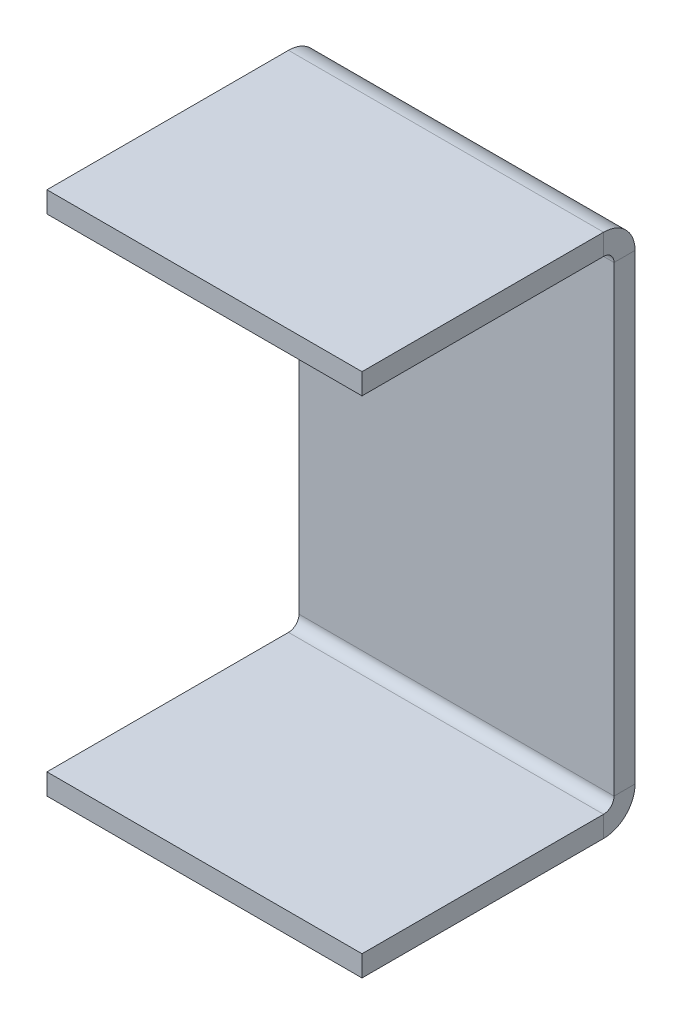
ISO-10303-21;
HEADER;
FILE_DESCRIPTION(('STEP AP214'),'2;1');
FILE_NAME('part.step','',(''),(''),'','','');
FILE_SCHEMA(('AUTOMOTIVE_DESIGN { 1 0 10303 214 1 1 1 1 }'));
ENDSEC;
DATA;
#1=APPLICATION_CONTEXT('core data for automotive mechanical design processes');
#2=APPLICATION_PROTOCOL_DEFINITION('international standard','automotive_design',2000,#1);
#3=PRODUCT_CONTEXT('',#1,'mechanical');
#4=PRODUCT('Part','Part','',(#3));
#5=PRODUCT_RELATED_PRODUCT_CATEGORY('part','',(#4));
#6=PRODUCT_DEFINITION_FORMATION('','',#4);
#7=PRODUCT_DEFINITION_CONTEXT('part definition',#1,'design');
#8=PRODUCT_DEFINITION('design','',#6,#7);
#9=PRODUCT_DEFINITION_SHAPE('','',#8);
#10=(LENGTH_UNIT() NAMED_UNIT(*) SI_UNIT(.MILLI.,.METRE.));
#11=(NAMED_UNIT(*) PLANE_ANGLE_UNIT() SI_UNIT($,.RADIAN.));
#12=(NAMED_UNIT(*) SI_UNIT($,.STERADIAN.) SOLID_ANGLE_UNIT());
#13=UNCERTAINTY_MEASURE_WITH_UNIT(LENGTH_MEASURE(1.E-05),#10,'distance_accuracy_value','');
#14=(GEOMETRIC_REPRESENTATION_CONTEXT(3) GLOBAL_UNCERTAINTY_ASSIGNED_CONTEXT((#13)) GLOBAL_UNIT_ASSIGNED_CONTEXT((#10,
#11,#12)) REPRESENTATION_CONTEXT('',''));
#15=CARTESIAN_POINT('',(0.,0.,0.));
#16=DIRECTION('',(0.,0.,1.));
#17=DIRECTION('',(1.,0.,0.));
#18=AXIS2_PLACEMENT_3D('',#15,#16,#17);
#19=CARTESIAN_POINT('',(0.,0.,-10.));
#20=DIRECTION('',(0.,0.,1.));
#21=DIRECTION('',(1.,0.,0.));
#22=AXIS2_PLACEMENT_3D('',#19,#20,#21);
#23=PLANE('',#22);
#24=DIRECTION('',(1.,0.,0.));
#25=VECTOR('',#24,1.);
#26=CARTESIAN_POINT('',(75.,-110.,-10.));
#27=LINE('',#26,#25);
#28=CARTESIAN_POINT('',(75.,-110.,-10.));
#29=VERTEX_POINT('',#28);
#30=CARTESIAN_POINT('',(-75.,-110.,-10.));
#31=VERTEX_POINT('',#30);
#32=EDGE_CURVE('E215',#29,#31,#27,.F.);
#33=ORIENTED_EDGE('',*,*,#32,.T.);
#34=DIRECTION('',(0.,-1.,0.));
#35=VECTOR('',#34,1.);
#36=CARTESIAN_POINT('',(-75.,125.,-10.));
#37=LINE('',#36,#35);
#38=CARTESIAN_POINT('',(-75.,110.,-10.));
#39=VERTEX_POINT('',#38);
#40=EDGE_CURVE('E13',#39,#31,#37,.T.);
#41=ORIENTED_EDGE('',*,*,#40,.F.);
#42=DIRECTION('',(-1.,0.,0.));
#43=VECTOR('',#42,1.);
#44=CARTESIAN_POINT('',(-75.,110.,-10.));
#45=LINE('',#44,#43);
#46=CARTESIAN_POINT('',(75.,110.,-10.));
#47=VERTEX_POINT('',#46);
#48=EDGE_CURVE('E269',#39,#47,#45,.F.);
#49=ORIENTED_EDGE('',*,*,#48,.T.);
#50=DIRECTION('',(0.,1.,0.));
#51=VECTOR('',#50,1.);
#52=CARTESIAN_POINT('',(75.,125.,-10.));
#53=LINE('',#52,#51);
#54=EDGE_CURVE('E88',#29,#47,#53,.T.);
#55=ORIENTED_EDGE('',*,*,#54,.F.);
#56=EDGE_LOOP('',(#33,#41,#49,#55));
#57=FACE_BOUND('',#56,.T.);
#58=ADVANCED_FACE('F79',(#57),#23,.F.);
#59=CARTESIAN_POINT('',(0.,0.,0.));
#60=DIRECTION('',(0.,0.,1.));
#61=DIRECTION('',(1.,0.,0.));
#62=AXIS2_PLACEMENT_3D('',#59,#60,#61);
#63=PLANE('',#62);
#64=DIRECTION('',(0.,-1.,0.));
#65=VECTOR('',#64,1.);
#66=CARTESIAN_POINT('',(-75.,125.,0.));
#67=LINE('',#66,#65);
#68=CARTESIAN_POINT('',(-75.,110.,0.));
#69=VERTEX_POINT('',#68);
#70=CARTESIAN_POINT('',(-75.,-110.,0.));
#71=VERTEX_POINT('',#70);
#72=EDGE_CURVE('E83',#69,#71,#67,.T.);
#73=ORIENTED_EDGE('',*,*,#72,.T.);
#74=DIRECTION('',(1.,0.,0.));
#75=VECTOR('',#74,1.);
#76=CARTESIAN_POINT('',(75.,-110.,0.));
#77=LINE('',#76,#75);
#78=CARTESIAN_POINT('',(75.,-110.,0.));
#79=VERTEX_POINT('',#78);
#80=EDGE_CURVE('E227',#79,#71,#77,.F.);
#81=ORIENTED_EDGE('',*,*,#80,.F.);
#82=DIRECTION('',(0.,1.,0.));
#83=VECTOR('',#82,1.);
#84=CARTESIAN_POINT('',(75.,125.,0.));
#85=LINE('',#84,#83);
#86=CARTESIAN_POINT('',(75.,110.,0.));
#87=VERTEX_POINT('',#86);
#88=EDGE_CURVE('E287',#79,#87,#85,.T.);
#89=ORIENTED_EDGE('',*,*,#88,.T.);
#90=DIRECTION('',(-1.,0.,0.));
#91=VECTOR('',#90,1.);
#92=CARTESIAN_POINT('',(-75.,110.,0.));
#93=LINE('',#92,#91);
#94=EDGE_CURVE('E96',#69,#87,#93,.F.);
#95=ORIENTED_EDGE('',*,*,#94,.F.);
#96=EDGE_LOOP('',(#73,#81,#89,#95));
#97=FACE_BOUND('',#96,.T.);
#98=ADVANCED_FACE('F291',(#97),#63,.T.);
#99=CARTESIAN_POINT('',(75.,125.,-10.));
#100=DIRECTION('',(1.,0.,0.));
#101=DIRECTION('',(0.,0.,-1.));
#102=AXIS2_PLACEMENT_3D('',#99,#100,#101);
#103=PLANE('',#102);
#104=ORIENTED_EDGE('',*,*,#88,.F.);
#105=DIRECTION('',(0.,0.,-1.));
#106=VECTOR('',#105,1.);
#107=CARTESIAN_POINT('',(75.,-110.,0.));
#108=LINE('',#107,#106);
#109=EDGE_CURVE('E221',#79,#29,#108,.T.);
#110=ORIENTED_EDGE('',*,*,#109,.T.);
#111=ORIENTED_EDGE('',*,*,#54,.T.);
#112=DIRECTION('',(0.,0.,-1.));
#113=VECTOR('',#112,1.);
#114=CARTESIAN_POINT('',(75.,110.,0.));
#115=LINE('',#114,#113);
#116=EDGE_CURVE('E284',#87,#47,#115,.T.);
#117=ORIENTED_EDGE('',*,*,#116,.F.);
#118=EDGE_LOOP('',(#104,#110,#111,#117));
#119=FACE_BOUND('',#118,.T.);
#120=ADVANCED_FACE('F81',(#119),#103,.T.);
#121=CARTESIAN_POINT('',(-75.,125.,-10.));
#122=DIRECTION('',(-1.,0.,0.));
#123=DIRECTION('',(0.,-1.,0.));
#124=AXIS2_PLACEMENT_3D('',#121,#122,#123);
#125=PLANE('',#124);
#126=DIRECTION('',(0.,0.,-1.));
#127=VECTOR('',#126,1.);
#128=CARTESIAN_POINT('',(-75.,-110.,0.));
#129=LINE('',#128,#127);
#130=EDGE_CURVE('E232',#71,#31,#129,.T.);
#131=ORIENTED_EDGE('',*,*,#130,.F.);
#132=ORIENTED_EDGE('',*,*,#72,.F.);
#133=DIRECTION('',(0.,0.,-1.));
#134=VECTOR('',#133,1.);
#135=CARTESIAN_POINT('',(-75.,110.,0.));
#136=LINE('',#135,#134);
#137=EDGE_CURVE('E275',#69,#39,#136,.T.);
#138=ORIENTED_EDGE('',*,*,#137,.T.);
#139=ORIENTED_EDGE('',*,*,#40,.T.);
#140=EDGE_LOOP('',(#131,#132,#138,#139));
#141=FACE_BOUND('',#140,.T.);
#142=ADVANCED_FACE('F314',(#141),#125,.T.);
#143=CARTESIAN_POINT('',(75.,110.,4.99999999999999));
#144=DIRECTION('',(1.,0.,0.));
#145=DIRECTION('',(0.,0.,-1.));
#146=AXIS2_PLACEMENT_3D('',#143,#144,#145);
#147=PLANE('',#146);
#148=DIRECTION('',(0.,1.,0.));
#149=VECTOR('',#148,1.);
#150=CARTESIAN_POINT('',(75.,125.,4.99999999999994));
#151=LINE('',#150,#149);
#152=CARTESIAN_POINT('',(75.,115.,4.99999999999998));
#153=VERTEX_POINT('',#152);
#154=CARTESIAN_POINT('',(75.,125.,4.99999999999994));
#155=VERTEX_POINT('',#154);
#156=EDGE_CURVE('E235',#153,#155,#151,.T.);
#157=ORIENTED_EDGE('',*,*,#156,.F.);
#158=CARTESIAN_POINT('',(75.,110.,4.99999999999999));
#159=DIRECTION('',(-1.,0.,0.));
#160=DIRECTION('',(0.,0.,1.));
#161=AXIS2_PLACEMENT_3D('',#158,#159,#160);
#162=CIRCLE('',#161,5.);
#163=EDGE_CURVE('E278',#87,#153,#162,.F.);
#164=ORIENTED_EDGE('',*,*,#163,.F.);
#165=ORIENTED_EDGE('',*,*,#116,.T.);
#166=CARTESIAN_POINT('',(75.,110.,4.99999999999999));
#167=DIRECTION('',(-1.,0.,0.));
#168=DIRECTION('',(0.,0.,1.));
#169=AXIS2_PLACEMENT_3D('',#166,#167,#168);
#170=CIRCLE('',#169,15.);
#171=EDGE_CURVE('E271',#47,#155,#170,.F.);
#172=ORIENTED_EDGE('',*,*,#171,.T.);
#173=EDGE_LOOP('',(#157,#164,#165,#172));
#174=FACE_BOUND('',#173,.T.);
#175=ADVANCED_FACE('F340',(#174),#147,.T.);
#176=CARTESIAN_POINT('',(-75.,110.,4.99999999999999));
#177=DIRECTION('',(1.,0.,0.));
#178=DIRECTION('',(0.,0.,-1.));
#179=AXIS2_PLACEMENT_3D('',#176,#177,#178);
#180=PLANE('',#179);
#181=CARTESIAN_POINT('',(-75.,110.,4.99999999999999));
#182=DIRECTION('',(-1.,0.,0.));
#183=DIRECTION('',(0.,0.,1.));
#184=AXIS2_PLACEMENT_3D('',#181,#182,#183);
#185=CIRCLE('',#184,5.);
#186=CARTESIAN_POINT('',(-75.,115.,4.99999999999998));
#187=VERTEX_POINT('',#186);
#188=EDGE_CURVE('E239',#187,#69,#185,.T.);
#189=ORIENTED_EDGE('',*,*,#188,.F.);
#190=DIRECTION('',(0.,1.,0.));
#191=VECTOR('',#190,1.);
#192=CARTESIAN_POINT('',(-75.,115.,4.99999999999998));
#193=LINE('',#192,#191);
#194=CARTESIAN_POINT('',(-75.,125.,4.99999999999994));
#195=VERTEX_POINT('',#194);
#196=EDGE_CURVE('E262',#187,#195,#193,.T.);
#197=ORIENTED_EDGE('',*,*,#196,.T.);
#198=CARTESIAN_POINT('',(-75.,110.,4.99999999999999));
#199=DIRECTION('',(-1.,0.,0.));
#200=DIRECTION('',(0.,0.,1.));
#201=AXIS2_PLACEMENT_3D('',#198,#199,#200);
#202=CIRCLE('',#201,15.);
#203=EDGE_CURVE('E272',#195,#39,#202,.T.);
#204=ORIENTED_EDGE('',*,*,#203,.T.);
#205=ORIENTED_EDGE('',*,*,#137,.F.);
#206=EDGE_LOOP('',(#189,#197,#204,#205));
#207=FACE_BOUND('',#206,.T.);
#208=ADVANCED_FACE('F321',(#207),#180,.F.);
#209=CARTESIAN_POINT('',(-75.,110.,4.99999999999999));
#210=DIRECTION('',(-1.,0.,0.));
#211=DIRECTION('',(0.,1.,0.));
#212=AXIS2_PLACEMENT_3D('',#209,#210,#211);
#213=CYLINDRICAL_SURFACE('',#212,15.);
#214=ORIENTED_EDGE('',*,*,#48,.F.);
#215=ORIENTED_EDGE('',*,*,#203,.F.);
#216=DIRECTION('',(-1.,0.,0.));
#217=VECTOR('',#216,1.);
#218=CARTESIAN_POINT('',(0.,125.,4.99999999999994));
#219=LINE('',#218,#217);
#220=EDGE_CURVE('E259',#155,#195,#219,.T.);
#221=ORIENTED_EDGE('',*,*,#220,.F.);
#222=ORIENTED_EDGE('',*,*,#171,.F.);
#223=EDGE_LOOP('',(#214,#215,#221,#222));
#224=FACE_BOUND('',#223,.T.);
#225=ADVANCED_FACE('F320',(#224),#213,.T.);
#226=CARTESIAN_POINT('',(-75.,110.,4.99999999999999));
#227=DIRECTION('',(-1.,0.,0.));
#228=DIRECTION('',(0.,1.,0.));
#229=AXIS2_PLACEMENT_3D('',#226,#227,#228);
#230=CYLINDRICAL_SURFACE('',#229,5.);
#231=ORIENTED_EDGE('',*,*,#94,.T.);
#232=ORIENTED_EDGE('',*,*,#163,.T.);
#233=DIRECTION('',(1.,0.,0.));
#234=VECTOR('',#233,1.);
#235=CARTESIAN_POINT('',(75.,115.,4.99999999999998));
#236=LINE('',#235,#234);
#237=EDGE_CURVE('E265',#153,#187,#236,.F.);
#238=ORIENTED_EDGE('',*,*,#237,.T.);
#239=ORIENTED_EDGE('',*,*,#188,.T.);
#240=EDGE_LOOP('',(#231,#232,#238,#239));
#241=FACE_BOUND('',#240,.T.);
#242=ADVANCED_FACE('F343',(#241),#230,.F.);
#243=CARTESIAN_POINT('',(-75.,125.,0.));
#244=DIRECTION('',(-1.,0.,0.));
#245=DIRECTION('',(0.,0.,1.));
#246=AXIS2_PLACEMENT_3D('',#243,#244,#245);
#247=PLANE('',#246);
#248=DIRECTION('',(0.,0.,-1.));
#249=VECTOR('',#248,1.);
#250=CARTESIAN_POINT('',(-75.,125.,0.));
#251=LINE('',#250,#249);
#252=CARTESIAN_POINT('',(-75.,125.,120.));
#253=VERTEX_POINT('',#252);
#254=EDGE_CURVE('E243',#253,#195,#251,.T.);
#255=ORIENTED_EDGE('',*,*,#254,.T.);
#256=ORIENTED_EDGE('',*,*,#196,.F.);
#257=DIRECTION('',(0.,0.,1.));
#258=VECTOR('',#257,1.);
#259=CARTESIAN_POINT('',(-75.,115.,-4.33680868994202E-13));
#260=LINE('',#259,#258);
#261=CARTESIAN_POINT('',(-75.,115.,120.));
#262=VERTEX_POINT('',#261);
#263=EDGE_CURVE('E251',#262,#187,#260,.F.);
#264=ORIENTED_EDGE('',*,*,#263,.F.);
#265=DIRECTION('',(0.,-1.,0.));
#266=VECTOR('',#265,1.);
#267=CARTESIAN_POINT('',(-75.,125.,120.));
#268=LINE('',#267,#266);
#269=EDGE_CURVE('E237',#253,#262,#268,.T.);
#270=ORIENTED_EDGE('',*,*,#269,.F.);
#271=EDGE_LOOP('',(#255,#256,#264,#270));
#272=FACE_BOUND('',#271,.T.);
#273=ADVANCED_FACE('F330',(#272),#247,.T.);
#274=CARTESIAN_POINT('',(75.,125.,120.));
#275=DIRECTION('',(1.,0.,0.));
#276=DIRECTION('',(0.,0.,-1.));
#277=AXIS2_PLACEMENT_3D('',#274,#275,#276);
#278=PLANE('',#277);
#279=DIRECTION('',(0.,0.,-1.));
#280=VECTOR('',#279,1.);
#281=CARTESIAN_POINT('',(75.,115.,-4.33680868994202E-13));
#282=LINE('',#281,#280);
#283=CARTESIAN_POINT('',(75.,115.,120.));
#284=VERTEX_POINT('',#283);
#285=EDGE_CURVE('E257',#153,#284,#282,.F.);
#286=ORIENTED_EDGE('',*,*,#285,.F.);
#287=ORIENTED_EDGE('',*,*,#156,.T.);
#288=DIRECTION('',(0.,0.,1.));
#289=VECTOR('',#288,1.);
#290=CARTESIAN_POINT('',(75.,125.,120.));
#291=LINE('',#290,#289);
#292=CARTESIAN_POINT('',(75.,125.,120.));
#293=VERTEX_POINT('',#292);
#294=EDGE_CURVE('E249',#155,#293,#291,.T.);
#295=ORIENTED_EDGE('',*,*,#294,.T.);
#296=DIRECTION('',(0.,-1.,0.));
#297=VECTOR('',#296,1.);
#298=CARTESIAN_POINT('',(75.,125.,120.));
#299=LINE('',#298,#297);
#300=EDGE_CURVE('E240',#293,#284,#299,.T.);
#301=ORIENTED_EDGE('',*,*,#300,.T.);
#302=EDGE_LOOP('',(#286,#287,#295,#301));
#303=FACE_BOUND('',#302,.T.);
#304=ADVANCED_FACE('F337',(#303),#278,.T.);
#305=CARTESIAN_POINT('',(0.,125.,-4.68595682382633E-13));
#306=DIRECTION('',(0.,1.,0.));
#307=DIRECTION('',(0.,0.,1.));
#308=AXIS2_PLACEMENT_3D('',#305,#306,#307);
#309=PLANE('',#308);
#310=ORIENTED_EDGE('',*,*,#294,.F.);
#311=ORIENTED_EDGE('',*,*,#220,.T.);
#312=ORIENTED_EDGE('',*,*,#254,.F.);
#313=DIRECTION('',(-1.,0.,0.));
#314=VECTOR('',#313,1.);
#315=CARTESIAN_POINT('',(-75.,125.,120.));
#316=LINE('',#315,#314);
#317=EDGE_CURVE('E246',#293,#253,#316,.T.);
#318=ORIENTED_EDGE('',*,*,#317,.F.);
#319=EDGE_LOOP('',(#310,#311,#312,#318));
#320=FACE_BOUND('',#319,.T.);
#321=ADVANCED_FACE('F328',(#320),#309,.T.);
#322=CARTESIAN_POINT('',(0.,115.,-4.33680868994202E-13));
#323=DIRECTION('',(0.,1.,0.));
#324=DIRECTION('',(0.,0.,1.));
#325=AXIS2_PLACEMENT_3D('',#322,#323,#324);
#326=PLANE('',#325);
#327=ORIENTED_EDGE('',*,*,#237,.F.);
#328=ORIENTED_EDGE('',*,*,#285,.T.);
#329=DIRECTION('',(1.,0.,0.));
#330=VECTOR('',#329,1.);
#331=CARTESIAN_POINT('',(0.,115.,120.));
#332=LINE('',#331,#330);
#333=EDGE_CURVE('E254',#284,#262,#332,.F.);
#334=ORIENTED_EDGE('',*,*,#333,.T.);
#335=ORIENTED_EDGE('',*,*,#263,.T.);
#336=EDGE_LOOP('',(#327,#328,#334,#335));
#337=FACE_BOUND('',#336,.T.);
#338=ADVANCED_FACE('F345',(#337),#326,.F.);
#339=CARTESIAN_POINT('',(-75.,125.,120.));
#340=DIRECTION('',(0.,0.,1.));
#341=DIRECTION('',(0.,-1.,0.));
#342=AXIS2_PLACEMENT_3D('',#339,#340,#341);
#343=PLANE('',#342);
#344=ORIENTED_EDGE('',*,*,#333,.F.);
#345=ORIENTED_EDGE('',*,*,#300,.F.);
#346=ORIENTED_EDGE('',*,*,#317,.T.);
#347=ORIENTED_EDGE('',*,*,#269,.T.);
#348=EDGE_LOOP('',(#344,#345,#346,#347));
#349=FACE_BOUND('',#348,.T.);
#350=ADVANCED_FACE('F334',(#349),#343,.T.);
#351=CARTESIAN_POINT('',(-75.,-110.,4.99999999999999));
#352=DIRECTION('',(-1.,0.,0.));
#353=DIRECTION('',(0.,0.,1.));
#354=AXIS2_PLACEMENT_3D('',#351,#352,#353);
#355=PLANE('',#354);
#356=DIRECTION('',(0.,-1.,0.));
#357=VECTOR('',#356,1.);
#358=CARTESIAN_POINT('',(-75.,-125.,4.99999999999994));
#359=LINE('',#358,#357);
#360=CARTESIAN_POINT('',(-75.,-115.,4.99999999999998));
#361=VERTEX_POINT('',#360);
#362=CARTESIAN_POINT('',(-75.,-125.,4.99999999999994));
#363=VERTEX_POINT('',#362);
#364=EDGE_CURVE('E212',#361,#363,#359,.T.);
#365=ORIENTED_EDGE('',*,*,#364,.F.);
#366=CARTESIAN_POINT('',(-75.,-110.,4.99999999999999));
#367=DIRECTION('',(1.,0.,0.));
#368=DIRECTION('',(0.,0.,-1.));
#369=AXIS2_PLACEMENT_3D('',#366,#367,#368);
#370=CIRCLE('',#369,5.);
#371=EDGE_CURVE('E224',#71,#361,#370,.F.);
#372=ORIENTED_EDGE('',*,*,#371,.F.);
#373=ORIENTED_EDGE('',*,*,#130,.T.);
#374=CARTESIAN_POINT('',(-75.,-110.,4.99999999999999));
#375=DIRECTION('',(1.,0.,0.));
#376=DIRECTION('',(0.,0.,-1.));
#377=AXIS2_PLACEMENT_3D('',#374,#375,#376);
#378=CIRCLE('',#377,15.);
#379=EDGE_CURVE('E217',#31,#363,#378,.F.);
#380=ORIENTED_EDGE('',*,*,#379,.T.);
#381=EDGE_LOOP('',(#365,#372,#373,#380));
#382=FACE_BOUND('',#381,.T.);
#383=ADVANCED_FACE('F300',(#382),#355,.T.);
#384=CARTESIAN_POINT('',(75.,-110.,4.99999999999999));
#385=DIRECTION('',(-1.,0.,0.));
#386=DIRECTION('',(0.,0.,1.));
#387=AXIS2_PLACEMENT_3D('',#384,#385,#386);
#388=PLANE('',#387);
#389=CARTESIAN_POINT('',(75.,-110.,4.99999999999999));
#390=DIRECTION('',(1.,0.,0.));
#391=DIRECTION('',(0.,0.,-1.));
#392=AXIS2_PLACEMENT_3D('',#389,#390,#391);
#393=CIRCLE('',#392,5.);
#394=CARTESIAN_POINT('',(75.,-115.,4.99999999999998));
#395=VERTEX_POINT('',#394);
#396=EDGE_CURVE('E182',#395,#79,#393,.T.);
#397=ORIENTED_EDGE('',*,*,#396,.F.);
#398=DIRECTION('',(0.,-1.,0.));
#399=VECTOR('',#398,1.);
#400=CARTESIAN_POINT('',(75.,-115.,4.99999999999998));
#401=LINE('',#400,#399);
#402=CARTESIAN_POINT('',(75.,-125.,4.99999999999994));
#403=VERTEX_POINT('',#402);
#404=EDGE_CURVE('E207',#395,#403,#401,.T.);
#405=ORIENTED_EDGE('',*,*,#404,.T.);
#406=CARTESIAN_POINT('',(75.,-110.,4.99999999999999));
#407=DIRECTION('',(1.,0.,0.));
#408=DIRECTION('',(0.,0.,-1.));
#409=AXIS2_PLACEMENT_3D('',#406,#407,#408);
#410=CIRCLE('',#409,15.);
#411=EDGE_CURVE('E218',#403,#29,#410,.T.);
#412=ORIENTED_EDGE('',*,*,#411,.T.);
#413=ORIENTED_EDGE('',*,*,#109,.F.);
#414=EDGE_LOOP('',(#397,#405,#412,#413));
#415=FACE_BOUND('',#414,.T.);
#416=ADVANCED_FACE('F309',(#415),#388,.F.);
#417=CARTESIAN_POINT('',(75.,-110.,4.99999999999999));
#418=DIRECTION('',(1.,0.,0.));
#419=DIRECTION('',(0.,-1.,0.));
#420=AXIS2_PLACEMENT_3D('',#417,#418,#419);
#421=CYLINDRICAL_SURFACE('',#420,15.);
#422=ORIENTED_EDGE('',*,*,#32,.F.);
#423=ORIENTED_EDGE('',*,*,#411,.F.);
#424=DIRECTION('',(1.,0.,0.));
#425=VECTOR('',#424,1.);
#426=CARTESIAN_POINT('',(-75.,-125.,4.99999999999994));
#427=LINE('',#426,#425);
#428=EDGE_CURVE('E191',#403,#363,#427,.F.);
#429=ORIENTED_EDGE('',*,*,#428,.T.);
#430=ORIENTED_EDGE('',*,*,#379,.F.);
#431=EDGE_LOOP('',(#422,#423,#429,#430));
#432=FACE_BOUND('',#431,.T.);
#433=ADVANCED_FACE('F312',(#432),#421,.T.);
#434=CARTESIAN_POINT('',(75.,-110.,4.99999999999999));
#435=DIRECTION('',(1.,0.,0.));
#436=DIRECTION('',(0.,-1.,0.));
#437=AXIS2_PLACEMENT_3D('',#434,#435,#436);
#438=CYLINDRICAL_SURFACE('',#437,5.);
#439=ORIENTED_EDGE('',*,*,#80,.T.);
#440=ORIENTED_EDGE('',*,*,#371,.T.);
#441=DIRECTION('',(1.,0.,0.));
#442=VECTOR('',#441,1.);
#443=CARTESIAN_POINT('',(-75.,-115.,4.99999999999998));
#444=LINE('',#443,#442);
#445=EDGE_CURVE('E210',#361,#395,#444,.T.);
#446=ORIENTED_EDGE('',*,*,#445,.T.);
#447=ORIENTED_EDGE('',*,*,#396,.T.);
#448=EDGE_LOOP('',(#439,#440,#446,#447));
#449=FACE_BOUND('',#448,.T.);
#450=ADVANCED_FACE('F296',(#449),#438,.F.);
#451=CARTESIAN_POINT('',(-75.,-125.,0.));
#452=DIRECTION('',(-1.,0.,0.));
#453=DIRECTION('',(0.,0.,1.));
#454=AXIS2_PLACEMENT_3D('',#451,#452,#453);
#455=PLANE('',#454);
#456=DIRECTION('',(0.,0.,1.));
#457=VECTOR('',#456,1.);
#458=CARTESIAN_POINT('',(-75.,-115.,-4.48136897960675E-13));
#459=LINE('',#458,#457);
#460=CARTESIAN_POINT('',(-75.,-115.,120.));
#461=VERTEX_POINT('',#460);
#462=EDGE_CURVE('E204',#361,#461,#459,.T.);
#463=ORIENTED_EDGE('',*,*,#462,.F.);
#464=ORIENTED_EDGE('',*,*,#364,.T.);
#465=DIRECTION('',(0.,0.,-1.));
#466=VECTOR('',#465,1.);
#467=CARTESIAN_POINT('',(-75.,-125.,0.));
#468=LINE('',#467,#466);
#469=CARTESIAN_POINT('',(-75.,-125.,120.));
#470=VERTEX_POINT('',#469);
#471=EDGE_CURVE('E196',#363,#470,#468,.F.);
#472=ORIENTED_EDGE('',*,*,#471,.T.);
#473=DIRECTION('',(0.,1.,0.));
#474=VECTOR('',#473,1.);
#475=CARTESIAN_POINT('',(-75.,-125.,120.));
#476=LINE('',#475,#474);
#477=EDGE_CURVE('E183',#470,#461,#476,.T.);
#478=ORIENTED_EDGE('',*,*,#477,.T.);
#479=EDGE_LOOP('',(#463,#464,#472,#478));
#480=FACE_BOUND('',#479,.T.);
#481=ADVANCED_FACE('F304',(#480),#455,.T.);
#482=CARTESIAN_POINT('',(75.,-125.,120.));
#483=DIRECTION('',(1.,0.,0.));
#484=DIRECTION('',(0.,0.,-1.));
#485=AXIS2_PLACEMENT_3D('',#482,#483,#484);
#486=PLANE('',#485);
#487=DIRECTION('',(0.,0.,1.));
#488=VECTOR('',#487,1.);
#489=CARTESIAN_POINT('',(75.,-125.,120.));
#490=LINE('',#489,#488);
#491=CARTESIAN_POINT('',(75.,-125.,120.));
#492=VERTEX_POINT('',#491);
#493=EDGE_CURVE('E175',#492,#403,#490,.F.);
#494=ORIENTED_EDGE('',*,*,#493,.T.);
#495=ORIENTED_EDGE('',*,*,#404,.F.);
#496=DIRECTION('',(0.,0.,-1.));
#497=VECTOR('',#496,1.);
#498=CARTESIAN_POINT('',(75.,-115.,-4.48136897960675E-13));
#499=LINE('',#498,#497);
#500=CARTESIAN_POINT('',(75.,-115.,120.));
#501=VERTEX_POINT('',#500);
#502=EDGE_CURVE('E177',#501,#395,#499,.T.);
#503=ORIENTED_EDGE('',*,*,#502,.F.);
#504=DIRECTION('',(0.,1.,0.));
#505=VECTOR('',#504,1.);
#506=CARTESIAN_POINT('',(75.,-125.,120.));
#507=LINE('',#506,#505);
#508=EDGE_CURVE('E171',#492,#501,#507,.T.);
#509=ORIENTED_EDGE('',*,*,#508,.F.);
#510=EDGE_LOOP('',(#494,#495,#503,#509));
#511=FACE_BOUND('',#510,.T.);
#512=ADVANCED_FACE('F173',(#511),#486,.T.);
#513=CARTESIAN_POINT('',(0.,-125.,-4.83051711349106E-13));
#514=DIRECTION('',(0.,1.,0.));
#515=DIRECTION('',(0.,0.,1.));
#516=AXIS2_PLACEMENT_3D('',#513,#514,#515);
#517=PLANE('',#516);
#518=ORIENTED_EDGE('',*,*,#428,.F.);
#519=ORIENTED_EDGE('',*,*,#493,.F.);
#520=DIRECTION('',(-1.,0.,0.));
#521=VECTOR('',#520,1.);
#522=CARTESIAN_POINT('',(-75.,-125.,120.));
#523=LINE('',#522,#521);
#524=EDGE_CURVE('E190',#470,#492,#523,.F.);
#525=ORIENTED_EDGE('',*,*,#524,.F.);
#526=ORIENTED_EDGE('',*,*,#471,.F.);
#527=EDGE_LOOP('',(#518,#519,#525,#526));
#528=FACE_BOUND('',#527,.T.);
#529=ADVANCED_FACE('F188',(#528),#517,.F.);
#530=CARTESIAN_POINT('',(0.,-115.,-4.48136897960675E-13));
#531=DIRECTION('',(0.,1.,0.));
#532=DIRECTION('',(0.,0.,1.));
#533=AXIS2_PLACEMENT_3D('',#530,#531,#532);
#534=PLANE('',#533);
#535=ORIENTED_EDGE('',*,*,#502,.T.);
#536=ORIENTED_EDGE('',*,*,#445,.F.);
#537=ORIENTED_EDGE('',*,*,#462,.T.);
#538=DIRECTION('',(1.,0.,0.));
#539=VECTOR('',#538,1.);
#540=CARTESIAN_POINT('',(0.,-115.,120.));
#541=LINE('',#540,#539);
#542=EDGE_CURVE('E202',#461,#501,#541,.T.);
#543=ORIENTED_EDGE('',*,*,#542,.T.);
#544=EDGE_LOOP('',(#535,#536,#537,#543));
#545=FACE_BOUND('',#544,.T.);
#546=ADVANCED_FACE('F306',(#545),#534,.T.);
#547=CARTESIAN_POINT('',(-75.,-125.,120.));
#548=DIRECTION('',(0.,0.,1.));
#549=DIRECTION('',(0.,-1.,0.));
#550=AXIS2_PLACEMENT_3D('',#547,#548,#549);
#551=PLANE('',#550);
#552=ORIENTED_EDGE('',*,*,#542,.F.);
#553=ORIENTED_EDGE('',*,*,#477,.F.);
#554=ORIENTED_EDGE('',*,*,#524,.T.);
#555=ORIENTED_EDGE('',*,*,#508,.T.);
#556=EDGE_LOOP('',(#552,#553,#554,#555));
#557=FACE_BOUND('',#556,.T.);
#558=ADVANCED_FACE('F194',(#557),#551,.T.);
#559=CLOSED_SHELL('',(#58,#98,#120,#142,#175,#208,#225,#242,#273,#304,#321,#338,#350,#383,#416,
#433,#450,#481,#512,#529,#546,#558));
#560=MANIFOLD_SOLID_BREP('B2',#559);
#561=ADVANCED_BREP_SHAPE_REPRESENTATION('',(#18,#560),#14);
#562=SHAPE_DEFINITION_REPRESENTATION(#9,#561);
ENDSEC;
END-ISO-10303-21;
